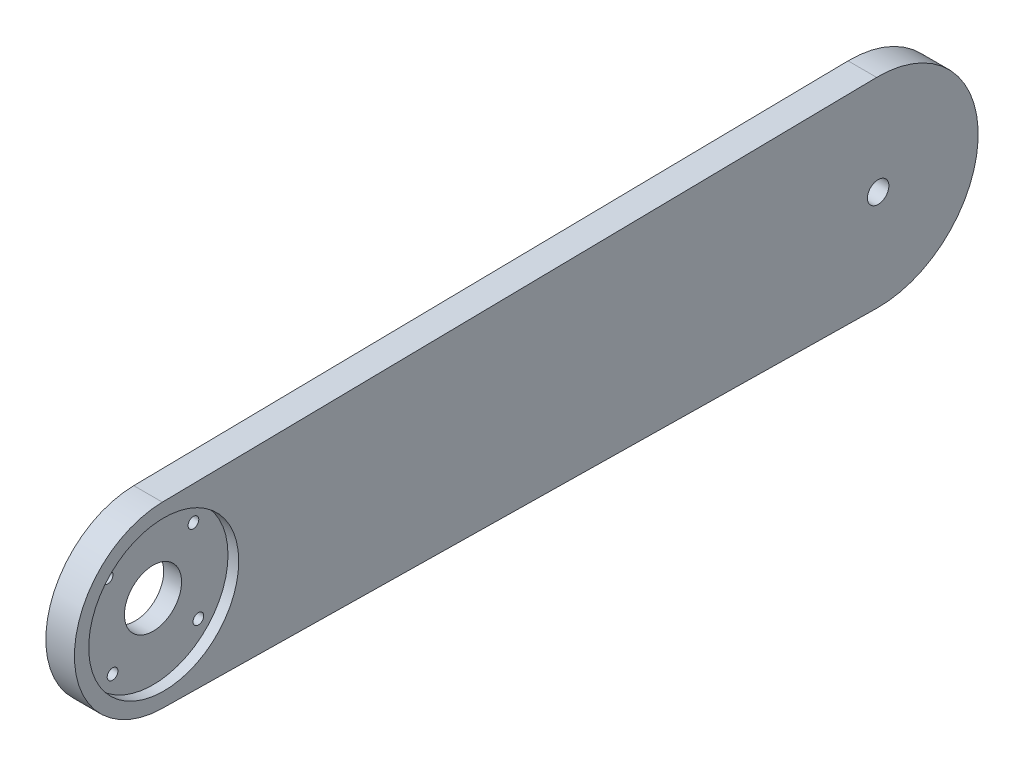
ISO-10303-21;
HEADER;
FILE_DESCRIPTION(('STEP AP214'),'2;1');
FILE_NAME('part.step','',(''),(''),'','','');
FILE_SCHEMA(('AUTOMOTIVE_DESIGN { 1 0 10303 214 1 1 1 1 }'));
ENDSEC;
DATA;
#1=APPLICATION_CONTEXT('core data for automotive mechanical design processes');
#2=APPLICATION_PROTOCOL_DEFINITION('international standard','automotive_design',2000,#1);
#3=PRODUCT_CONTEXT('',#1,'mechanical');
#4=PRODUCT('Part','Part','',(#3));
#5=PRODUCT_RELATED_PRODUCT_CATEGORY('part','',(#4));
#6=PRODUCT_DEFINITION_FORMATION('','',#4);
#7=PRODUCT_DEFINITION_CONTEXT('part definition',#1,'design');
#8=PRODUCT_DEFINITION('design','',#6,#7);
#9=PRODUCT_DEFINITION_SHAPE('','',#8);
#10=(LENGTH_UNIT() NAMED_UNIT(*) SI_UNIT(.MILLI.,.METRE.));
#11=(NAMED_UNIT(*) PLANE_ANGLE_UNIT() SI_UNIT($,.RADIAN.));
#12=(NAMED_UNIT(*) SI_UNIT($,.STERADIAN.) SOLID_ANGLE_UNIT());
#13=UNCERTAINTY_MEASURE_WITH_UNIT(LENGTH_MEASURE(1.E-05),#10,'distance_accuracy_value','');
#14=(GEOMETRIC_REPRESENTATION_CONTEXT(3) GLOBAL_UNCERTAINTY_ASSIGNED_CONTEXT((#13)) GLOBAL_UNIT_ASSIGNED_CONTEXT((#10,
#11,#12)) REPRESENTATION_CONTEXT('',''));
#15=CARTESIAN_POINT('',(0.,0.,0.));
#16=DIRECTION('',(0.,0.,1.));
#17=DIRECTION('',(1.,0.,0.));
#18=AXIS2_PLACEMENT_3D('',#15,#16,#17);
#19=CARTESIAN_POINT('',(4.,0.,70.));
#20=DIRECTION('',(-1.,0.,0.));
#21=DIRECTION('',(0.,0.,1.));
#22=AXIS2_PLACEMENT_3D('',#19,#20,#21);
#23=CYLINDRICAL_SURFACE('',#22,4.00000000000001);
#24=CARTESIAN_POINT('',(0.,0.,70.));
#25=DIRECTION('',(1.,0.,0.));
#26=DIRECTION('',(0.,0.,-1.));
#27=AXIS2_PLACEMENT_3D('',#24,#25,#26);
#28=CIRCLE('',#27,4.00000000000001);
#29=CARTESIAN_POINT('',(0.,0.,66.));
#30=VERTEX_POINT('',#29);
#31=EDGE_CURVE('E112',#30,#30,#28,.T.);
#32=ORIENTED_EDGE('',*,*,#31,.F.);
#33=EDGE_LOOP('',(#32));
#34=FACE_BOUND('',#33,.T.);
#35=CARTESIAN_POINT('',(2.5,0.,70.));
#36=DIRECTION('',(1.,0.,0.));
#37=DIRECTION('',(0.,0.,-1.));
#38=AXIS2_PLACEMENT_3D('',#35,#36,#37);
#39=CIRCLE('',#38,4.00000000000001);
#40=CARTESIAN_POINT('',(2.5,0.,66.));
#41=VERTEX_POINT('',#40);
#42=EDGE_CURVE('E109',#41,#41,#39,.T.);
#43=ORIENTED_EDGE('',*,*,#42,.T.);
#44=EDGE_LOOP('',(#43));
#45=FACE_BOUND('',#44,.T.);
#46=ADVANCED_FACE('F33',(#34,#45),#23,.F.);
#47=CARTESIAN_POINT('',(4.,0.,70.));
#48=DIRECTION('',(1.,0.,0.));
#49=DIRECTION('',(0.,0.,-1.));
#50=AXIS2_PLACEMENT_3D('',#47,#48,#49);
#51=PLANE('',#50);
#52=CARTESIAN_POINT('',(4.,0.,70.));
#53=DIRECTION('',(1.,0.,0.));
#54=DIRECTION('',(0.,0.,-1.));
#55=AXIS2_PLACEMENT_3D('',#52,#53,#54);
#56=CIRCLE('',#55,10.5);
#57=CARTESIAN_POINT('',(4.,0.,59.5));
#58=VERTEX_POINT('',#57);
#59=EDGE_CURVE('E117',#58,#58,#56,.T.);
#60=ORIENTED_EDGE('',*,*,#59,.F.);
#61=EDGE_LOOP('',(#60));
#62=FACE_BOUND('',#61,.T.);
#63=CARTESIAN_POINT('',(4.,0.,-30.));
#64=DIRECTION('',(1.,0.,0.));
#65=DIRECTION('',(0.,0.,-1.));
#66=AXIS2_PLACEMENT_3D('',#63,#64,#65);
#67=CIRCLE('',#66,1.5);
#68=CARTESIAN_POINT('',(4.,0.,-31.5));
#69=VERTEX_POINT('',#68);
#70=EDGE_CURVE('E103',#69,#69,#67,.T.);
#71=ORIENTED_EDGE('',*,*,#70,.F.);
#72=EDGE_LOOP('',(#71));
#73=FACE_BOUND('',#72,.T.);
#74=CARTESIAN_POINT('',(4.,0.,70.));
#75=DIRECTION('',(1.,0.,0.));
#76=DIRECTION('',(0.,0.,-1.));
#77=AXIS2_PLACEMENT_3D('',#74,#75,#76);
#78=CIRCLE('',#77,12.5);
#79=CARTESIAN_POINT('',(4.,12.4985936708895,70.1875));
#80=VERTEX_POINT('',#79);
#81=CARTESIAN_POINT('',(4.,-12.4985936708895,70.1875));
#82=VERTEX_POINT('',#81);
#83=EDGE_CURVE('E87',#80,#82,#78,.T.);
#84=ORIENTED_EDGE('',*,*,#83,.T.);
#85=DIRECTION('',(0.,-0.0149999999999999,-0.999887493671163));
#86=VECTOR('',#85,1.);
#87=CARTESIAN_POINT('',(4.,-12.4985936708895,70.1875));
#88=LINE('',#87,#86);
#89=CARTESIAN_POINT('',(4.,-13.9984249113963,-29.79));
#90=VERTEX_POINT('',#89);
#91=EDGE_CURVE('E82',#82,#90,#88,.T.);
#92=ORIENTED_EDGE('',*,*,#91,.T.);
#93=CARTESIAN_POINT('',(4.,0.,-30.));
#94=DIRECTION('',(1.,0.,0.));
#95=DIRECTION('',(0.,0.,-1.));
#96=AXIS2_PLACEMENT_3D('',#93,#94,#95);
#97=CIRCLE('',#96,14.);
#98=CARTESIAN_POINT('',(4.,13.9984249113963,-29.79));
#99=VERTEX_POINT('',#98);
#100=EDGE_CURVE('E85',#90,#99,#97,.T.);
#101=ORIENTED_EDGE('',*,*,#100,.T.);
#102=DIRECTION('',(0.,-0.0150000000000001,0.999887493671163));
#103=VECTOR('',#102,1.);
#104=CARTESIAN_POINT('',(4.,12.4985936708895,70.1875));
#105=LINE('',#104,#103);
#106=EDGE_CURVE('E52',#99,#80,#105,.T.);
#107=ORIENTED_EDGE('',*,*,#106,.T.);
#108=EDGE_LOOP('',(#84,#92,#101,#107));
#109=FACE_BOUND('',#108,.T.);
#110=ADVANCED_FACE('F83',(#62,#73,#109),#51,.T.);
#111=CARTESIAN_POINT('',(0.,0.,70.));
#112=DIRECTION('',(1.,0.,0.));
#113=DIRECTION('',(0.,0.,-1.));
#114=AXIS2_PLACEMENT_3D('',#111,#112,#113);
#115=PLANE('',#114);
#116=CARTESIAN_POINT('',(0.,-6.3481083902204,75.6580933065838));
#117=DIRECTION('',(-1.,0.,0.));
#118=DIRECTION('',(0.,0.,1.));
#119=AXIS2_PLACEMENT_3D('',#116,#117,#118);
#120=CIRCLE('',#119,0.749999999999999);
#121=CARTESIAN_POINT('',(0.,-6.3481083902204,76.4080933065838));
#122=VERTEX_POINT('',#121);
#123=EDGE_CURVE('E134',#122,#122,#120,.T.);
#124=ORIENTED_EDGE('',*,*,#123,.F.);
#125=EDGE_LOOP('',(#124));
#126=FACE_BOUND('',#125,.T.);
#127=CARTESIAN_POINT('',(0.,6.34810839022073,64.3419066934157));
#128=DIRECTION('',(-1.,0.,0.));
#129=DIRECTION('',(0.,0.,1.));
#130=AXIS2_PLACEMENT_3D('',#127,#128,#129);
#131=CIRCLE('',#130,0.750000000000376);
#132=CARTESIAN_POINT('',(0.,6.34810839022073,65.0919066934161));
#133=VERTEX_POINT('',#132);
#134=EDGE_CURVE('E124',#133,#133,#131,.T.);
#135=ORIENTED_EDGE('',*,*,#134,.F.);
#136=EDGE_LOOP('',(#135));
#137=FACE_BOUND('',#136,.T.);
#138=CARTESIAN_POINT('',(0.,5.65809330658422,76.3481083902203));
#139=DIRECTION('',(-1.,0.,0.));
#140=DIRECTION('',(0.,0.,1.));
#141=AXIS2_PLACEMENT_3D('',#138,#139,#140);
#142=CIRCLE('',#141,0.749999999999999);
#143=CARTESIAN_POINT('',(0.,5.65809330658422,77.0981083902203));
#144=VERTEX_POINT('',#143);
#145=EDGE_CURVE('E121',#144,#144,#142,.T.);
#146=ORIENTED_EDGE('',*,*,#145,.F.);
#147=EDGE_LOOP('',(#146));
#148=FACE_BOUND('',#147,.T.);
#149=CARTESIAN_POINT('',(0.,-5.65809330658389,63.6518916097792));
#150=DIRECTION('',(-1.,0.,0.));
#151=DIRECTION('',(0.,0.,1.));
#152=AXIS2_PLACEMENT_3D('',#149,#150,#151);
#153=CIRCLE('',#152,0.750000000000361);
#154=CARTESIAN_POINT('',(0.,-5.65809330658389,64.4018916097796));
#155=VERTEX_POINT('',#154);
#156=EDGE_CURVE('E118',#155,#155,#153,.T.);
#157=ORIENTED_EDGE('',*,*,#156,.F.);
#158=EDGE_LOOP('',(#157));
#159=FACE_BOUND('',#158,.T.);
#160=CARTESIAN_POINT('',(0.,0.,-30.));
#161=DIRECTION('',(1.,0.,0.));
#162=DIRECTION('',(0.,0.,-1.));
#163=AXIS2_PLACEMENT_3D('',#160,#161,#162);
#164=CIRCLE('',#163,1.5);
#165=CARTESIAN_POINT('',(0.,0.,-31.5));
#166=VERTEX_POINT('',#165);
#167=EDGE_CURVE('E145',#166,#166,#164,.T.);
#168=ORIENTED_EDGE('',*,*,#167,.T.);
#169=EDGE_LOOP('',(#168));
#170=FACE_BOUND('',#169,.T.);
#171=CARTESIAN_POINT('',(0.,0.,70.));
#172=DIRECTION('',(1.,0.,0.));
#173=DIRECTION('',(0.,0.,-1.));
#174=AXIS2_PLACEMENT_3D('',#171,#172,#173);
#175=CIRCLE('',#174,12.5);
#176=CARTESIAN_POINT('',(0.,12.4985936708895,70.1875));
#177=VERTEX_POINT('',#176);
#178=CARTESIAN_POINT('',(0.,-12.4985936708895,70.1875));
#179=VERTEX_POINT('',#178);
#180=EDGE_CURVE('E100',#177,#179,#175,.T.);
#181=ORIENTED_EDGE('',*,*,#180,.F.);
#182=DIRECTION('',(0.,-0.0150000000000001,0.999887493671163));
#183=VECTOR('',#182,1.);
#184=CARTESIAN_POINT('',(0.,12.4985936708895,70.1875));
#185=LINE('',#184,#183);
#186=CARTESIAN_POINT('',(0.,13.9984249113963,-29.79));
#187=VERTEX_POINT('',#186);
#188=EDGE_CURVE('E75',#187,#177,#185,.T.);
#189=ORIENTED_EDGE('',*,*,#188,.F.);
#190=CARTESIAN_POINT('',(0.,0.,-30.));
#191=DIRECTION('',(1.,0.,0.));
#192=DIRECTION('',(0.,0.,-1.));
#193=AXIS2_PLACEMENT_3D('',#190,#191,#192);
#194=CIRCLE('',#193,14.);
#195=CARTESIAN_POINT('',(0.,-13.9984249113963,-29.79));
#196=VERTEX_POINT('',#195);
#197=EDGE_CURVE('E69',#196,#187,#194,.T.);
#198=ORIENTED_EDGE('',*,*,#197,.F.);
#199=DIRECTION('',(0.,-0.0149999999999999,-0.999887493671163));
#200=VECTOR('',#199,1.);
#201=CARTESIAN_POINT('',(0.,-12.4985936708895,70.1875));
#202=LINE('',#201,#200);
#203=EDGE_CURVE('E91',#179,#196,#202,.T.);
#204=ORIENTED_EDGE('',*,*,#203,.F.);
#205=EDGE_LOOP('',(#181,#189,#198,#204));
#206=FACE_BOUND('',#205,.T.);
#207=ORIENTED_EDGE('',*,*,#31,.T.);
#208=EDGE_LOOP('',(#207));
#209=FACE_BOUND('',#208,.T.);
#210=ADVANCED_FACE('F151',(#126,#137,#148,#159,#170,#206,#209),#115,.F.);
#211=CARTESIAN_POINT('',(4.,0.,70.));
#212=DIRECTION('',(-1.,0.,0.));
#213=DIRECTION('',(0.,0.,1.));
#214=AXIS2_PLACEMENT_3D('',#211,#212,#213);
#215=CYLINDRICAL_SURFACE('',#214,12.5);
#216=ORIENTED_EDGE('',*,*,#180,.T.);
#217=DIRECTION('',(-1.,0.,0.));
#218=VECTOR('',#217,1.);
#219=CARTESIAN_POINT('',(4.,-12.4985936708895,70.1875));
#220=LINE('',#219,#218);
#221=EDGE_CURVE('E11',#82,#179,#220,.T.);
#222=ORIENTED_EDGE('',*,*,#221,.F.);
#223=ORIENTED_EDGE('',*,*,#83,.F.);
#224=DIRECTION('',(-1.,0.,0.));
#225=VECTOR('',#224,1.);
#226=CARTESIAN_POINT('',(4.,12.4985936708895,70.1875));
#227=LINE('',#226,#225);
#228=EDGE_CURVE('E96',#80,#177,#227,.T.);
#229=ORIENTED_EDGE('',*,*,#228,.T.);
#230=EDGE_LOOP('',(#216,#222,#223,#229));
#231=FACE_BOUND('',#230,.T.);
#232=ADVANCED_FACE('F35',(#231),#215,.T.);
#233=CARTESIAN_POINT('',(4.,-12.4985936708895,70.1875));
#234=DIRECTION('',(0.,0.999887493671163,-0.0149999999999999));
#235=DIRECTION('',(0.,0.0149999999999999,0.999887493671163));
#236=AXIS2_PLACEMENT_3D('',#233,#234,#235);
#237=PLANE('',#236);
#238=ORIENTED_EDGE('',*,*,#203,.T.);
#239=DIRECTION('',(-1.,0.,0.));
#240=VECTOR('',#239,1.);
#241=CARTESIAN_POINT('',(4.,-13.9984249113963,-29.79));
#242=LINE('',#241,#240);
#243=EDGE_CURVE('E43',#90,#196,#242,.T.);
#244=ORIENTED_EDGE('',*,*,#243,.F.);
#245=ORIENTED_EDGE('',*,*,#91,.F.);
#246=ORIENTED_EDGE('',*,*,#221,.T.);
#247=EDGE_LOOP('',(#238,#244,#245,#246));
#248=FACE_BOUND('',#247,.T.);
#249=ADVANCED_FACE('F90',(#248),#237,.F.);
#250=CARTESIAN_POINT('',(4.,0.,-30.));
#251=DIRECTION('',(-1.,0.,0.));
#252=DIRECTION('',(0.,0.,1.));
#253=AXIS2_PLACEMENT_3D('',#250,#251,#252);
#254=CYLINDRICAL_SURFACE('',#253,14.);
#255=ORIENTED_EDGE('',*,*,#197,.T.);
#256=DIRECTION('',(-1.,0.,0.));
#257=VECTOR('',#256,1.);
#258=CARTESIAN_POINT('',(4.,13.9984249113963,-29.79));
#259=LINE('',#258,#257);
#260=EDGE_CURVE('E92',#99,#187,#259,.T.);
#261=ORIENTED_EDGE('',*,*,#260,.F.);
#262=ORIENTED_EDGE('',*,*,#100,.F.);
#263=ORIENTED_EDGE('',*,*,#243,.T.);
#264=EDGE_LOOP('',(#255,#261,#262,#263));
#265=FACE_BOUND('',#264,.T.);
#266=ADVANCED_FACE('F94',(#265),#254,.T.);
#267=CARTESIAN_POINT('',(4.,12.4985936708895,70.1875));
#268=DIRECTION('',(0.,-0.999887493671163,-0.0150000000000001));
#269=DIRECTION('',(0.,0.0150000000000001,-0.999887493671163));
#270=AXIS2_PLACEMENT_3D('',#267,#268,#269);
#271=PLANE('',#270);
#272=ORIENTED_EDGE('',*,*,#188,.T.);
#273=ORIENTED_EDGE('',*,*,#228,.F.);
#274=ORIENTED_EDGE('',*,*,#106,.F.);
#275=ORIENTED_EDGE('',*,*,#260,.T.);
#276=EDGE_LOOP('',(#272,#273,#274,#275));
#277=FACE_BOUND('',#276,.T.);
#278=ADVANCED_FACE('F157',(#277),#271,.F.);
#279=CARTESIAN_POINT('',(4.,0.,-30.));
#280=DIRECTION('',(-1.,0.,0.));
#281=DIRECTION('',(0.,0.,1.));
#282=AXIS2_PLACEMENT_3D('',#279,#280,#281);
#283=CYLINDRICAL_SURFACE('',#282,1.5);
#284=ORIENTED_EDGE('',*,*,#70,.T.);
#285=EDGE_LOOP('',(#284));
#286=FACE_BOUND('',#285,.T.);
#287=ORIENTED_EDGE('',*,*,#167,.F.);
#288=EDGE_LOOP('',(#287));
#289=FACE_BOUND('',#288,.T.);
#290=ADVANCED_FACE('F154',(#286,#289),#283,.F.);
#291=CARTESIAN_POINT('',(2.5,0.,70.));
#292=DIRECTION('',(1.,0.,0.));
#293=DIRECTION('',(0.,0.,-1.));
#294=AXIS2_PLACEMENT_3D('',#291,#292,#293);
#295=CYLINDRICAL_SURFACE('',#294,10.5);
#296=CARTESIAN_POINT('',(2.5,0.,70.));
#297=DIRECTION('',(1.,0.,0.));
#298=DIRECTION('',(0.,0.,-1.));
#299=AXIS2_PLACEMENT_3D('',#296,#297,#298);
#300=CIRCLE('',#299,10.5);
#301=CARTESIAN_POINT('',(2.5,0.,59.5));
#302=VERTEX_POINT('',#301);
#303=EDGE_CURVE('E113',#302,#302,#300,.T.);
#304=ORIENTED_EDGE('',*,*,#303,.F.);
#305=EDGE_LOOP('',(#304));
#306=FACE_BOUND('',#305,.T.);
#307=ORIENTED_EDGE('',*,*,#59,.T.);
#308=EDGE_LOOP('',(#307));
#309=FACE_BOUND('',#308,.T.);
#310=ADVANCED_FACE('F156',(#306,#309),#295,.F.);
#311=CARTESIAN_POINT('',(2.5,0.,70.));
#312=DIRECTION('',(1.,0.,0.));
#313=DIRECTION('',(0.,0.,-1.));
#314=AXIS2_PLACEMENT_3D('',#311,#312,#313);
#315=PLANE('',#314);
#316=CARTESIAN_POINT('',(2.5,-6.3481083902204,75.6580933065838));
#317=DIRECTION('',(1.,0.,0.));
#318=DIRECTION('',(0.,0.,-1.));
#319=AXIS2_PLACEMENT_3D('',#316,#317,#318);
#320=CIRCLE('',#319,0.749999999999999);
#321=CARTESIAN_POINT('',(2.5,-6.3481083902204,74.9080933065838));
#322=VERTEX_POINT('',#321);
#323=EDGE_CURVE('E37',#322,#322,#320,.T.);
#324=ORIENTED_EDGE('',*,*,#323,.F.);
#325=EDGE_LOOP('',(#324));
#326=FACE_BOUND('',#325,.T.);
#327=CARTESIAN_POINT('',(2.5,6.34810839022073,64.3419066934157));
#328=DIRECTION('',(1.,0.,0.));
#329=DIRECTION('',(0.,0.,-1.));
#330=AXIS2_PLACEMENT_3D('',#327,#328,#329);
#331=CIRCLE('',#330,0.750000000000376);
#332=CARTESIAN_POINT('',(2.5,6.34810839022073,63.5919066934153));
#333=VERTEX_POINT('',#332);
#334=EDGE_CURVE('E122',#333,#333,#331,.T.);
#335=ORIENTED_EDGE('',*,*,#334,.F.);
#336=EDGE_LOOP('',(#335));
#337=FACE_BOUND('',#336,.T.);
#338=CARTESIAN_POINT('',(2.5,5.65809330658422,76.3481083902203));
#339=DIRECTION('',(1.,0.,0.));
#340=DIRECTION('',(0.,0.,-1.));
#341=AXIS2_PLACEMENT_3D('',#338,#339,#340);
#342=CIRCLE('',#341,0.749999999999999);
#343=CARTESIAN_POINT('',(2.5,5.65809330658422,75.5981083902203));
#344=VERTEX_POINT('',#343);
#345=EDGE_CURVE('E119',#344,#344,#342,.T.);
#346=ORIENTED_EDGE('',*,*,#345,.F.);
#347=EDGE_LOOP('',(#346));
#348=FACE_BOUND('',#347,.T.);
#349=CARTESIAN_POINT('',(2.5,-5.65809330658389,63.6518916097792));
#350=DIRECTION('',(1.,0.,0.));
#351=DIRECTION('',(0.,0.,-1.));
#352=AXIS2_PLACEMENT_3D('',#349,#350,#351);
#353=CIRCLE('',#352,0.750000000000361);
#354=CARTESIAN_POINT('',(2.5,-5.65809330658389,62.9018916097788));
#355=VERTEX_POINT('',#354);
#356=EDGE_CURVE('E114',#355,#355,#353,.T.);
#357=ORIENTED_EDGE('',*,*,#356,.F.);
#358=EDGE_LOOP('',(#357));
#359=FACE_BOUND('',#358,.T.);
#360=ORIENTED_EDGE('',*,*,#42,.F.);
#361=EDGE_LOOP('',(#360));
#362=FACE_BOUND('',#361,.T.);
#363=ORIENTED_EDGE('',*,*,#303,.T.);
#364=EDGE_LOOP('',(#363));
#365=FACE_BOUND('',#364,.T.);
#366=ADVANCED_FACE('F164',(#326,#337,#348,#359,#362,#365),#315,.T.);
#367=CARTESIAN_POINT('',(10.,-5.65809330658389,63.6518916097792));
#368=DIRECTION('',(-1.,0.,0.));
#369=DIRECTION('',(0.,0.,1.));
#370=AXIS2_PLACEMENT_3D('',#367,#368,#369);
#371=CYLINDRICAL_SURFACE('',#370,0.750000000000361);
#372=ORIENTED_EDGE('',*,*,#356,.T.);
#373=EDGE_LOOP('',(#372));
#374=FACE_BOUND('',#373,.T.);
#375=ORIENTED_EDGE('',*,*,#156,.T.);
#376=EDGE_LOOP('',(#375));
#377=FACE_BOUND('',#376,.T.);
#378=ADVANCED_FACE('F181',(#374,#377),#371,.F.);
#379=CARTESIAN_POINT('',(10.,5.65809330658422,76.3481083902203));
#380=DIRECTION('',(-1.,0.,0.));
#381=DIRECTION('',(0.,0.,1.));
#382=AXIS2_PLACEMENT_3D('',#379,#380,#381);
#383=CYLINDRICAL_SURFACE('',#382,0.749999999999999);
#384=ORIENTED_EDGE('',*,*,#345,.T.);
#385=EDGE_LOOP('',(#384));
#386=FACE_BOUND('',#385,.T.);
#387=ORIENTED_EDGE('',*,*,#145,.T.);
#388=EDGE_LOOP('',(#387));
#389=FACE_BOUND('',#388,.T.);
#390=ADVANCED_FACE('F185',(#386,#389),#383,.F.);
#391=CARTESIAN_POINT('',(10.,6.34810839022073,64.3419066934157));
#392=DIRECTION('',(-1.,0.,0.));
#393=DIRECTION('',(0.,0.,1.));
#394=AXIS2_PLACEMENT_3D('',#391,#392,#393);
#395=CYLINDRICAL_SURFACE('',#394,0.750000000000376);
#396=ORIENTED_EDGE('',*,*,#334,.T.);
#397=EDGE_LOOP('',(#396));
#398=FACE_BOUND('',#397,.T.);
#399=ORIENTED_EDGE('',*,*,#134,.T.);
#400=EDGE_LOOP('',(#399));
#401=FACE_BOUND('',#400,.T.);
#402=ADVANCED_FACE('F189',(#398,#401),#395,.F.);
#403=CARTESIAN_POINT('',(10.,-6.3481083902204,75.6580933065838));
#404=DIRECTION('',(-1.,0.,0.));
#405=DIRECTION('',(0.,0.,1.));
#406=AXIS2_PLACEMENT_3D('',#403,#404,#405);
#407=CYLINDRICAL_SURFACE('',#406,0.749999999999999);
#408=ORIENTED_EDGE('',*,*,#323,.T.);
#409=EDGE_LOOP('',(#408));
#410=FACE_BOUND('',#409,.T.);
#411=ORIENTED_EDGE('',*,*,#123,.T.);
#412=EDGE_LOOP('',(#411));
#413=FACE_BOUND('',#412,.T.);
#414=ADVANCED_FACE('F193',(#410,#413),#407,.F.);
#415=CLOSED_SHELL('',(#46,#110,#210,#232,#249,#266,#278,#290,#310,#366,#378,#390,#402,#414));
#416=MANIFOLD_SOLID_BREP('B2',#415);
#417=ADVANCED_BREP_SHAPE_REPRESENTATION('',(#18,#416),#14);
#418=SHAPE_DEFINITION_REPRESENTATION(#9,#417);
ENDSEC;
END-ISO-10303-21;
